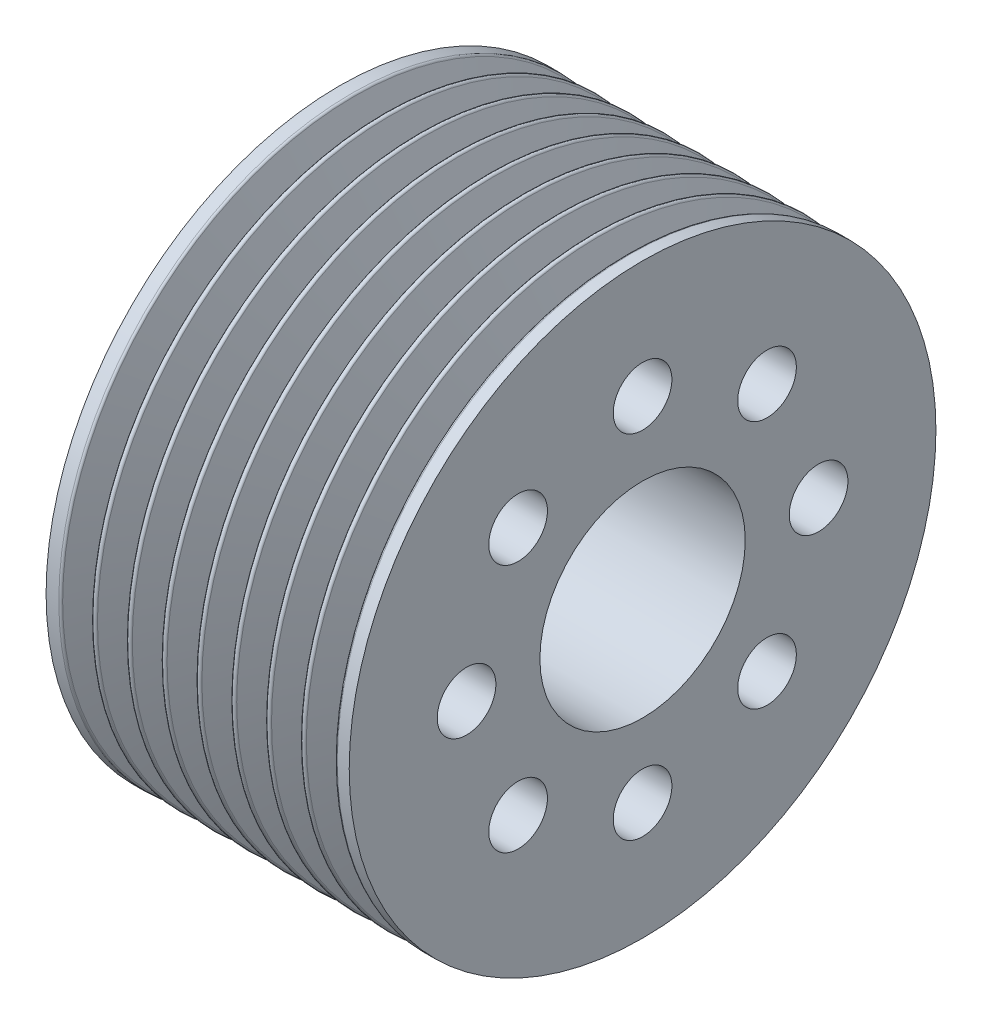
ISO-10303-21;
HEADER;
FILE_DESCRIPTION(('STEP AP214'),'2;1');
FILE_NAME('part.step','',(''),(''),'','','');
FILE_SCHEMA(('AUTOMOTIVE_DESIGN { 1 0 10303 214 1 1 1 1 }'));
ENDSEC;
DATA;
#1=APPLICATION_CONTEXT('core data for automotive mechanical design processes');
#2=APPLICATION_PROTOCOL_DEFINITION('international standard','automotive_design',2000,#1);
#3=PRODUCT_CONTEXT('',#1,'mechanical');
#4=PRODUCT('Part','Part','',(#3));
#5=PRODUCT_RELATED_PRODUCT_CATEGORY('part','',(#4));
#6=PRODUCT_DEFINITION_FORMATION('','',#4);
#7=PRODUCT_DEFINITION_CONTEXT('part definition',#1,'design');
#8=PRODUCT_DEFINITION('design','',#6,#7);
#9=PRODUCT_DEFINITION_SHAPE('','',#8);
#10=(LENGTH_UNIT() NAMED_UNIT(*) SI_UNIT(.MILLI.,.METRE.));
#11=(NAMED_UNIT(*) PLANE_ANGLE_UNIT() SI_UNIT($,.RADIAN.));
#12=(NAMED_UNIT(*) SI_UNIT($,.STERADIAN.) SOLID_ANGLE_UNIT());
#13=UNCERTAINTY_MEASURE_WITH_UNIT(LENGTH_MEASURE(1.E-05),#10,'distance_accuracy_value','');
#14=(GEOMETRIC_REPRESENTATION_CONTEXT(3) GLOBAL_UNCERTAINTY_ASSIGNED_CONTEXT((#13)) GLOBAL_UNIT_ASSIGNED_CONTEXT((#10,
#11,#12)) REPRESENTATION_CONTEXT('',''));
#15=CARTESIAN_POINT('',(0.,0.,0.));
#16=DIRECTION('',(0.,0.,1.));
#17=DIRECTION('',(1.,0.,0.));
#18=AXIS2_PLACEMENT_3D('',#15,#16,#17);
#19=CARTESIAN_POINT('',(0.,0.,0.));
#20=DIRECTION('',(-1.,0.,0.));
#21=DIRECTION('',(0.,0.,1.));
#22=AXIS2_PLACEMENT_3D('',#19,#20,#21);
#23=CYLINDRICAL_SURFACE('',#22,30.);
#24=CARTESIAN_POINT('',(18.,0.,0.));
#25=DIRECTION('',(-1.,0.,0.));
#26=DIRECTION('',(0.,0.,1.));
#27=AXIS2_PLACEMENT_3D('',#24,#25,#26);
#28=CIRCLE('',#27,30.);
#29=CARTESIAN_POINT('',(18.,0.,30.));
#30=VERTEX_POINT('',#29);
#31=EDGE_CURVE('E59',#30,#30,#28,.T.);
#32=ORIENTED_EDGE('',*,*,#31,.F.);
#33=EDGE_LOOP('',(#32));
#34=FACE_BOUND('',#33,.T.);
#35=CARTESIAN_POINT('',(19.3,0.,0.));
#36=DIRECTION('',(-1.,0.,0.));
#37=DIRECTION('',(0.,0.,1.));
#38=AXIS2_PLACEMENT_3D('',#35,#36,#37);
#39=CIRCLE('',#38,30.);
#40=CARTESIAN_POINT('',(19.3,0.,30.));
#41=VERTEX_POINT('',#40);
#42=EDGE_CURVE('E210',#41,#41,#39,.T.);
#43=ORIENTED_EDGE('',*,*,#42,.T.);
#44=EDGE_LOOP('',(#43));
#45=FACE_BOUND('',#44,.T.);
#46=ADVANCED_FACE('F45',(#34,#45),#23,.T.);
#47=CARTESIAN_POINT('',(31.5,10.5,0.));
#48=DIRECTION('',(1.,0.,0.));
#49=DIRECTION('',(0.,0.,-1.));
#50=AXIS2_PLACEMENT_3D('',#47,#48,#49);
#51=PLANE('',#50);
#52=CARTESIAN_POINT('',(31.5,12.7279220613579,12.7279220613579));
#53=DIRECTION('',(1.,0.,0.));
#54=DIRECTION('',(0.,0.,-1.));
#55=AXIS2_PLACEMENT_3D('',#52,#53,#54);
#56=CIRCLE('',#55,3.);
#57=CARTESIAN_POINT('',(31.5,12.7279220613579,9.72792206135786));
#58=VERTEX_POINT('',#57);
#59=EDGE_CURVE('E270',#58,#58,#56,.F.);
#60=ORIENTED_EDGE('',*,*,#59,.F.);
#61=EDGE_LOOP('',(#60));
#62=FACE_BOUND('',#61,.T.);
#63=CARTESIAN_POINT('',(31.5,-12.7279220613579,12.7279220613579));
#64=DIRECTION('',(1.,0.,0.));
#65=DIRECTION('',(0.,0.,-1.));
#66=AXIS2_PLACEMENT_3D('',#63,#64,#65);
#67=CIRCLE('',#66,3.);
#68=CARTESIAN_POINT('',(31.5,-12.7279220613579,9.72792206135786));
#69=VERTEX_POINT('',#68);
#70=EDGE_CURVE('E262',#69,#69,#67,.F.);
#71=ORIENTED_EDGE('',*,*,#70,.F.);
#72=EDGE_LOOP('',(#71));
#73=FACE_BOUND('',#72,.T.);
#74=CARTESIAN_POINT('',(31.5,-18.,0.));
#75=DIRECTION('',(1.,0.,0.));
#76=DIRECTION('',(0.,0.,-1.));
#77=AXIS2_PLACEMENT_3D('',#74,#75,#76);
#78=CIRCLE('',#77,3.);
#79=CARTESIAN_POINT('',(31.5,-18.,-3.));
#80=VERTEX_POINT('',#79);
#81=EDGE_CURVE('E254',#80,#80,#78,.F.);
#82=ORIENTED_EDGE('',*,*,#81,.F.);
#83=EDGE_LOOP('',(#82));
#84=FACE_BOUND('',#83,.T.);
#85=CARTESIAN_POINT('',(31.5,-12.7279220613579,-12.7279220613579));
#86=DIRECTION('',(1.,0.,0.));
#87=DIRECTION('',(0.,0.,-1.));
#88=AXIS2_PLACEMENT_3D('',#85,#86,#87);
#89=CIRCLE('',#88,3.);
#90=CARTESIAN_POINT('',(31.5,-12.7279220613579,-15.7279220613579));
#91=VERTEX_POINT('',#90);
#92=EDGE_CURVE('E246',#91,#91,#89,.F.);
#93=ORIENTED_EDGE('',*,*,#92,.F.);
#94=EDGE_LOOP('',(#93));
#95=FACE_BOUND('',#94,.T.);
#96=CARTESIAN_POINT('',(31.5,0.,-18.));
#97=DIRECTION('',(1.,0.,0.));
#98=DIRECTION('',(0.,0.,-1.));
#99=AXIS2_PLACEMENT_3D('',#96,#97,#98);
#100=CIRCLE('',#99,3.);
#101=CARTESIAN_POINT('',(31.5,0.,-21.));
#102=VERTEX_POINT('',#101);
#103=EDGE_CURVE('E238',#102,#102,#100,.F.);
#104=ORIENTED_EDGE('',*,*,#103,.F.);
#105=EDGE_LOOP('',(#104));
#106=FACE_BOUND('',#105,.T.);
#107=CARTESIAN_POINT('',(31.5,12.7279220613579,-12.7279220613579));
#108=DIRECTION('',(1.,0.,0.));
#109=DIRECTION('',(0.,0.,-1.));
#110=AXIS2_PLACEMENT_3D('',#107,#108,#109);
#111=CIRCLE('',#110,3.);
#112=CARTESIAN_POINT('',(31.5,12.7279220613579,-15.7279220613579));
#113=VERTEX_POINT('',#112);
#114=EDGE_CURVE('E230',#113,#113,#111,.F.);
#115=ORIENTED_EDGE('',*,*,#114,.F.);
#116=EDGE_LOOP('',(#115));
#117=FACE_BOUND('',#116,.T.);
#118=CARTESIAN_POINT('',(31.5,0.,18.));
#119=DIRECTION('',(1.,0.,0.));
#120=DIRECTION('',(0.,0.,-1.));
#121=AXIS2_PLACEMENT_3D('',#118,#119,#120);
#122=CIRCLE('',#121,3.);
#123=CARTESIAN_POINT('',(31.5,0.,15.));
#124=VERTEX_POINT('',#123);
#125=EDGE_CURVE('E222',#124,#124,#122,.F.);
#126=ORIENTED_EDGE('',*,*,#125,.F.);
#127=EDGE_LOOP('',(#126));
#128=FACE_BOUND('',#127,.T.);
#129=CARTESIAN_POINT('',(31.5,18.,0.));
#130=DIRECTION('',(1.,0.,0.));
#131=DIRECTION('',(0.,0.,-1.));
#132=AXIS2_PLACEMENT_3D('',#129,#130,#131);
#133=CIRCLE('',#132,3.);
#134=CARTESIAN_POINT('',(31.5,18.,-3.));
#135=VERTEX_POINT('',#134);
#136=EDGE_CURVE('E214',#135,#135,#133,.F.);
#137=ORIENTED_EDGE('',*,*,#136,.F.);
#138=EDGE_LOOP('',(#137));
#139=FACE_BOUND('',#138,.T.);
#140=CARTESIAN_POINT('',(31.5,0.,0.));
#141=DIRECTION('',(-1.,0.,0.));
#142=DIRECTION('',(0.,0.,1.));
#143=AXIS2_PLACEMENT_3D('',#140,#141,#142);
#144=CIRCLE('',#143,10.5);
#145=CARTESIAN_POINT('',(31.5,0.,10.5));
#146=VERTEX_POINT('',#145);
#147=EDGE_CURVE('E74',#146,#146,#144,.T.);
#148=ORIENTED_EDGE('',*,*,#147,.F.);
#149=EDGE_LOOP('',(#148));
#150=FACE_BOUND('',#149,.T.);
#151=CARTESIAN_POINT('',(31.5,0.,0.));
#152=DIRECTION('',(-1.,0.,0.));
#153=DIRECTION('',(0.,0.,1.));
#154=AXIS2_PLACEMENT_3D('',#151,#152,#153);
#155=CIRCLE('',#154,21.5);
#156=CARTESIAN_POINT('',(31.5,0.,21.5));
#157=VERTEX_POINT('',#156);
#158=EDGE_CURVE('E10',#157,#157,#155,.T.);
#159=ORIENTED_EDGE('',*,*,#158,.T.);
#160=EDGE_LOOP('',(#159));
#161=FACE_BOUND('',#160,.T.);
#162=ADVANCED_FACE('F48',(#62,#73,#84,#95,#106,#117,#128,#139,#150,#161),#51,.F.);
#163=CARTESIAN_POINT('',(0.,0.,0.));
#164=DIRECTION('',(-1.,0.,0.));
#165=DIRECTION('',(0.,0.,1.));
#166=AXIS2_PLACEMENT_3D('',#163,#164,#165);
#167=CYLINDRICAL_SURFACE('',#166,21.5);
#168=ORIENTED_EDGE('',*,*,#158,.F.);
#169=EDGE_LOOP('',(#168));
#170=FACE_BOUND('',#169,.T.);
#171=CARTESIAN_POINT('',(18.,0.,0.));
#172=DIRECTION('',(-1.,0.,0.));
#173=DIRECTION('',(0.,0.,1.));
#174=AXIS2_PLACEMENT_3D('',#171,#172,#173);
#175=CIRCLE('',#174,21.5);
#176=CARTESIAN_POINT('',(18.,0.,21.5));
#177=VERTEX_POINT('',#176);
#178=EDGE_CURVE('E54',#177,#177,#175,.T.);
#179=ORIENTED_EDGE('',*,*,#178,.T.);
#180=EDGE_LOOP('',(#179));
#181=FACE_BOUND('',#180,.T.);
#182=ADVANCED_FACE('F312',(#170,#181),#167,.F.);
#183=CARTESIAN_POINT('',(18.,30.,0.));
#184=DIRECTION('',(1.,0.,0.));
#185=DIRECTION('',(0.,0.,-1.));
#186=AXIS2_PLACEMENT_3D('',#183,#184,#185);
#187=PLANE('',#186);
#188=ORIENTED_EDGE('',*,*,#178,.F.);
#189=EDGE_LOOP('',(#188));
#190=FACE_BOUND('',#189,.T.);
#191=ORIENTED_EDGE('',*,*,#31,.T.);
#192=EDGE_LOOP('',(#191));
#193=FACE_BOUND('',#192,.T.);
#194=ADVANCED_FACE('F318',(#190,#193),#187,.F.);
#195=CARTESIAN_POINT('',(47.78,0.,0.));
#196=DIRECTION('',(-1.,0.,0.));
#197=DIRECTION('',(0.,0.,1.));
#198=AXIS2_PLACEMENT_3D('',#195,#196,#197);
#199=CIRCLE('',#198,30.);
#200=CARTESIAN_POINT('',(47.78,0.,30.));
#201=VERTEX_POINT('',#200);
#202=EDGE_CURVE('E94',#201,#201,#199,.T.);
#203=ORIENTED_EDGE('',*,*,#202,.F.);
#204=EDGE_LOOP('',(#203));
#205=FACE_BOUND('',#204,.T.);
#206=CARTESIAN_POINT('',(49.,0.,0.));
#207=DIRECTION('',(-1.,0.,0.));
#208=DIRECTION('',(0.,0.,1.));
#209=AXIS2_PLACEMENT_3D('',#206,#207,#208);
#210=CIRCLE('',#209,30.);
#211=CARTESIAN_POINT('',(49.,0.,30.));
#212=VERTEX_POINT('',#211);
#213=EDGE_CURVE('E64',#212,#212,#210,.T.);
#214=ORIENTED_EDGE('',*,*,#213,.T.);
#215=EDGE_LOOP('',(#214));
#216=FACE_BOUND('',#215,.T.);
#217=ADVANCED_FACE('F285',(#205,#216),#23,.T.);
#218=CARTESIAN_POINT('',(49.,10.5,0.));
#219=DIRECTION('',(-1.,0.,0.));
#220=DIRECTION('',(0.,0.,1.));
#221=AXIS2_PLACEMENT_3D('',#218,#219,#220);
#222=PLANE('',#221);
#223=CARTESIAN_POINT('',(49.,12.7279220613579,12.7279220613579));
#224=DIRECTION('',(1.,0.,0.));
#225=DIRECTION('',(0.,0.,-1.));
#226=AXIS2_PLACEMENT_3D('',#223,#224,#225);
#227=CIRCLE('',#226,3.);
#228=CARTESIAN_POINT('',(49.,12.7279220613579,9.72792206135786));
#229=VERTEX_POINT('',#228);
#230=EDGE_CURVE('E274',#229,#229,#227,.T.);
#231=ORIENTED_EDGE('',*,*,#230,.F.);
#232=EDGE_LOOP('',(#231));
#233=FACE_BOUND('',#232,.T.);
#234=CARTESIAN_POINT('',(49.,-12.7279220613579,12.7279220613579));
#235=DIRECTION('',(1.,0.,0.));
#236=DIRECTION('',(0.,0.,-1.));
#237=AXIS2_PLACEMENT_3D('',#234,#235,#236);
#238=CIRCLE('',#237,3.);
#239=CARTESIAN_POINT('',(49.,-12.7279220613579,9.72792206135786));
#240=VERTEX_POINT('',#239);
#241=EDGE_CURVE('E266',#240,#240,#238,.T.);
#242=ORIENTED_EDGE('',*,*,#241,.F.);
#243=EDGE_LOOP('',(#242));
#244=FACE_BOUND('',#243,.T.);
#245=CARTESIAN_POINT('',(49.,-18.,0.));
#246=DIRECTION('',(1.,0.,0.));
#247=DIRECTION('',(0.,0.,-1.));
#248=AXIS2_PLACEMENT_3D('',#245,#246,#247);
#249=CIRCLE('',#248,3.);
#250=CARTESIAN_POINT('',(49.,-18.,-3.));
#251=VERTEX_POINT('',#250);
#252=EDGE_CURVE('E258',#251,#251,#249,.T.);
#253=ORIENTED_EDGE('',*,*,#252,.F.);
#254=EDGE_LOOP('',(#253));
#255=FACE_BOUND('',#254,.T.);
#256=CARTESIAN_POINT('',(49.,-12.7279220613579,-12.7279220613579));
#257=DIRECTION('',(1.,0.,0.));
#258=DIRECTION('',(0.,0.,-1.));
#259=AXIS2_PLACEMENT_3D('',#256,#257,#258);
#260=CIRCLE('',#259,3.);
#261=CARTESIAN_POINT('',(49.,-12.7279220613579,-15.7279220613579));
#262=VERTEX_POINT('',#261);
#263=EDGE_CURVE('E250',#262,#262,#260,.T.);
#264=ORIENTED_EDGE('',*,*,#263,.F.);
#265=EDGE_LOOP('',(#264));
#266=FACE_BOUND('',#265,.T.);
#267=CARTESIAN_POINT('',(49.,0.,-18.));
#268=DIRECTION('',(1.,0.,0.));
#269=DIRECTION('',(0.,0.,-1.));
#270=AXIS2_PLACEMENT_3D('',#267,#268,#269);
#271=CIRCLE('',#270,3.);
#272=CARTESIAN_POINT('',(49.,0.,-21.));
#273=VERTEX_POINT('',#272);
#274=EDGE_CURVE('E242',#273,#273,#271,.T.);
#275=ORIENTED_EDGE('',*,*,#274,.F.);
#276=EDGE_LOOP('',(#275));
#277=FACE_BOUND('',#276,.T.);
#278=CARTESIAN_POINT('',(49.,12.7279220613579,-12.7279220613579));
#279=DIRECTION('',(1.,0.,0.));
#280=DIRECTION('',(0.,0.,-1.));
#281=AXIS2_PLACEMENT_3D('',#278,#279,#280);
#282=CIRCLE('',#281,3.);
#283=CARTESIAN_POINT('',(49.,12.7279220613579,-15.7279220613579));
#284=VERTEX_POINT('',#283);
#285=EDGE_CURVE('E234',#284,#284,#282,.T.);
#286=ORIENTED_EDGE('',*,*,#285,.F.);
#287=EDGE_LOOP('',(#286));
#288=FACE_BOUND('',#287,.T.);
#289=CARTESIAN_POINT('',(49.,0.,18.));
#290=DIRECTION('',(1.,0.,0.));
#291=DIRECTION('',(0.,0.,-1.));
#292=AXIS2_PLACEMENT_3D('',#289,#290,#291);
#293=CIRCLE('',#292,3.);
#294=CARTESIAN_POINT('',(49.,0.,15.));
#295=VERTEX_POINT('',#294);
#296=EDGE_CURVE('E226',#295,#295,#293,.T.);
#297=ORIENTED_EDGE('',*,*,#296,.F.);
#298=EDGE_LOOP('',(#297));
#299=FACE_BOUND('',#298,.T.);
#300=CARTESIAN_POINT('',(49.,18.,0.));
#301=DIRECTION('',(1.,0.,0.));
#302=DIRECTION('',(0.,0.,-1.));
#303=AXIS2_PLACEMENT_3D('',#300,#301,#302);
#304=CIRCLE('',#303,3.);
#305=CARTESIAN_POINT('',(49.,18.,-3.));
#306=VERTEX_POINT('',#305);
#307=EDGE_CURVE('E218',#306,#306,#304,.T.);
#308=ORIENTED_EDGE('',*,*,#307,.F.);
#309=EDGE_LOOP('',(#308));
#310=FACE_BOUND('',#309,.T.);
#311=ORIENTED_EDGE('',*,*,#213,.F.);
#312=EDGE_LOOP('',(#311));
#313=FACE_BOUND('',#312,.T.);
#314=CARTESIAN_POINT('',(49.,0.,0.));
#315=DIRECTION('',(-1.,0.,0.));
#316=DIRECTION('',(0.,0.,1.));
#317=AXIS2_PLACEMENT_3D('',#314,#315,#316);
#318=CIRCLE('',#317,10.5);
#319=CARTESIAN_POINT('',(49.,0.,10.5));
#320=VERTEX_POINT('',#319);
#321=EDGE_CURVE('E70',#320,#320,#318,.T.);
#322=ORIENTED_EDGE('',*,*,#321,.T.);
#323=EDGE_LOOP('',(#322));
#324=FACE_BOUND('',#323,.T.);
#325=ADVANCED_FACE('F281',(#233,#244,#255,#266,#277,#288,#299,#310,#313,#324),#222,.F.);
#326=CARTESIAN_POINT('',(0.,0.,0.));
#327=DIRECTION('',(-1.,0.,0.));
#328=DIRECTION('',(0.,0.,1.));
#329=AXIS2_PLACEMENT_3D('',#326,#327,#328);
#330=CYLINDRICAL_SURFACE('',#329,10.5);
#331=ORIENTED_EDGE('',*,*,#321,.F.);
#332=EDGE_LOOP('',(#331));
#333=FACE_BOUND('',#332,.T.);
#334=ORIENTED_EDGE('',*,*,#147,.T.);
#335=EDGE_LOOP('',(#334));
#336=FACE_BOUND('',#335,.T.);
#337=ADVANCED_FACE('F284',(#333,#336),#330,.F.);
#338=CARTESIAN_POINT('',(47.78,0.,0.));
#339=DIRECTION('',(-1.,0.,0.));
#340=DIRECTION('',(0.,0.,1.));
#341=AXIS2_PLACEMENT_3D('',#338,#339,#340);
#342=TOROIDAL_SURFACE('',#341,29.75,0.249999999999997);
#343=ORIENTED_EDGE('',*,*,#202,.T.);
#344=EDGE_LOOP('',(#343));
#345=FACE_BOUND('',#344,.T.);
#346=CARTESIAN_POINT('',(47.5458319526879,0.,0.));
#347=DIRECTION('',(-1.,0.,0.));
#348=DIRECTION('',(0.,0.,1.));
#349=AXIS2_PLACEMENT_3D('',#346,#347,#348);
#350=CIRCLE('',#349,29.8375518453149);
#351=CARTESIAN_POINT('',(47.5458319526879,0.,29.8375518453149));
#352=VERTEX_POINT('',#351);
#353=EDGE_CURVE('E78',#352,#352,#350,.T.);
#354=ORIENTED_EDGE('',*,*,#353,.F.);
#355=EDGE_LOOP('',(#354));
#356=FACE_BOUND('',#355,.T.);
#357=ADVANCED_FACE('F307',(#345,#356),#342,.T.);
#358=CARTESIAN_POINT('',(46.2810016567745,0.,0.));
#359=DIRECTION('',(1.,0.,0.));
#360=DIRECTION('',(0.,0.,-1.));
#361=AXIS2_PLACEMENT_3D('',#358,#359,#360);
#362=CONICAL_SURFACE('',#361,26.4546095496951,1.21300383013606);
#363=ORIENTED_EDGE('',*,*,#353,.T.);
#364=EDGE_LOOP('',(#363));
#365=FACE_BOUND('',#364,.T.);
#366=CARTESIAN_POINT('',(46.2810016567745,0.,0.));
#367=DIRECTION('',(-1.,0.,0.));
#368=DIRECTION('',(0.,0.,1.));
#369=AXIS2_PLACEMENT_3D('',#366,#367,#368);
#370=CIRCLE('',#369,26.4546095496951);
#371=CARTESIAN_POINT('',(46.2810016567745,0.,26.4546095496951));
#372=VERTEX_POINT('',#371);
#373=EDGE_CURVE('E82',#372,#372,#370,.T.);
#374=ORIENTED_EDGE('',*,*,#373,.F.);
#375=EDGE_LOOP('',(#374));
#376=FACE_BOUND('',#375,.T.);
#377=ADVANCED_FACE('F508',(#365,#376),#362,.T.);
#378=CARTESIAN_POINT('',(46.,0.,0.));
#379=DIRECTION('',(-1.,0.,0.));
#380=DIRECTION('',(0.,0.,1.));
#381=AXIS2_PLACEMENT_3D('',#378,#379,#380);
#382=TOROIDAL_SURFACE('',#381,26.5596717640729,0.300000000000001);
#383=ORIENTED_EDGE('',*,*,#373,.T.);
#384=EDGE_LOOP('',(#383));
#385=FACE_BOUND('',#384,.T.);
#386=CARTESIAN_POINT('',(45.7189983432255,0.,0.));
#387=DIRECTION('',(-1.,0.,0.));
#388=DIRECTION('',(0.,0.,1.));
#389=AXIS2_PLACEMENT_3D('',#386,#387,#388);
#390=CIRCLE('',#389,26.4546095496951);
#391=CARTESIAN_POINT('',(45.7189983432255,0.,26.4546095496951));
#392=VERTEX_POINT('',#391);
#393=EDGE_CURVE('E86',#392,#392,#390,.T.);
#394=ORIENTED_EDGE('',*,*,#393,.F.);
#395=EDGE_LOOP('',(#394));
#396=FACE_BOUND('',#395,.T.);
#397=ADVANCED_FACE('F503',(#385,#396),#382,.F.);
#398=CARTESIAN_POINT('',(44.4541680473121,0.,0.));
#399=DIRECTION('',(-1.,0.,0.));
#400=DIRECTION('',(0.,0.,1.));
#401=AXIS2_PLACEMENT_3D('',#398,#399,#400);
#402=CONICAL_SURFACE('',#401,29.8375518453149,1.21300383013606);
#403=ORIENTED_EDGE('',*,*,#393,.T.);
#404=EDGE_LOOP('',(#403));
#405=FACE_BOUND('',#404,.T.);
#406=CARTESIAN_POINT('',(44.4541680473121,0.,0.));
#407=DIRECTION('',(-1.,0.,0.));
#408=DIRECTION('',(0.,0.,1.));
#409=AXIS2_PLACEMENT_3D('',#406,#407,#408);
#410=CIRCLE('',#409,29.8375518453149);
#411=CARTESIAN_POINT('',(44.4541680473121,0.,29.8375518453149));
#412=VERTEX_POINT('',#411);
#413=EDGE_CURVE('E90',#412,#412,#410,.T.);
#414=ORIENTED_EDGE('',*,*,#413,.F.);
#415=EDGE_LOOP('',(#414));
#416=FACE_BOUND('',#415,.T.);
#417=ADVANCED_FACE('F498',(#405,#416),#402,.T.);
#418=CARTESIAN_POINT('',(44.22,0.,0.));
#419=DIRECTION('',(-1.,0.,0.));
#420=DIRECTION('',(0.,0.,1.));
#421=AXIS2_PLACEMENT_3D('',#418,#419,#420);
#422=TOROIDAL_SURFACE('',#421,29.75,0.250000000000004);
#423=ORIENTED_EDGE('',*,*,#413,.T.);
#424=EDGE_LOOP('',(#423));
#425=FACE_BOUND('',#424,.T.);
#426=CARTESIAN_POINT('',(43.9858319526879,0.,0.));
#427=DIRECTION('',(-1.,0.,0.));
#428=DIRECTION('',(0.,0.,1.));
#429=AXIS2_PLACEMENT_3D('',#426,#427,#428);
#430=CIRCLE('',#429,29.8375518453149);
#431=CARTESIAN_POINT('',(43.9858319526879,0.,29.8375518453149));
#432=VERTEX_POINT('',#431);
#433=EDGE_CURVE('E98',#432,#432,#430,.T.);
#434=ORIENTED_EDGE('',*,*,#433,.F.);
#435=EDGE_LOOP('',(#434));
#436=FACE_BOUND('',#435,.T.);
#437=ADVANCED_FACE('F493',(#425,#436),#422,.T.);
#438=CARTESIAN_POINT('',(42.7210016567745,0.,0.));
#439=DIRECTION('',(1.,0.,0.));
#440=DIRECTION('',(0.,0.,-1.));
#441=AXIS2_PLACEMENT_3D('',#438,#439,#440);
#442=CONICAL_SURFACE('',#441,26.4546095496951,1.21300383013606);
#443=ORIENTED_EDGE('',*,*,#433,.T.);
#444=EDGE_LOOP('',(#443));
#445=FACE_BOUND('',#444,.T.);
#446=CARTESIAN_POINT('',(42.7210016567745,0.,0.));
#447=DIRECTION('',(-1.,0.,0.));
#448=DIRECTION('',(0.,0.,1.));
#449=AXIS2_PLACEMENT_3D('',#446,#447,#448);
#450=CIRCLE('',#449,26.4546095496951);
#451=CARTESIAN_POINT('',(42.7210016567745,0.,26.4546095496951));
#452=VERTEX_POINT('',#451);
#453=EDGE_CURVE('E102',#452,#452,#450,.T.);
#454=ORIENTED_EDGE('',*,*,#453,.F.);
#455=EDGE_LOOP('',(#454));
#456=FACE_BOUND('',#455,.T.);
#457=ADVANCED_FACE('F488',(#445,#456),#442,.T.);
#458=CARTESIAN_POINT('',(42.44,0.,0.));
#459=DIRECTION('',(-1.,0.,0.));
#460=DIRECTION('',(0.,0.,1.));
#461=AXIS2_PLACEMENT_3D('',#458,#459,#460);
#462=TOROIDAL_SURFACE('',#461,26.5596717640729,0.300000000000001);
#463=ORIENTED_EDGE('',*,*,#453,.T.);
#464=EDGE_LOOP('',(#463));
#465=FACE_BOUND('',#464,.T.);
#466=CARTESIAN_POINT('',(42.1589983432255,0.,0.));
#467=DIRECTION('',(-1.,0.,0.));
#468=DIRECTION('',(0.,0.,1.));
#469=AXIS2_PLACEMENT_3D('',#466,#467,#468);
#470=CIRCLE('',#469,26.4546095496951);
#471=CARTESIAN_POINT('',(42.1589983432255,0.,26.4546095496951));
#472=VERTEX_POINT('',#471);
#473=EDGE_CURVE('E106',#472,#472,#470,.T.);
#474=ORIENTED_EDGE('',*,*,#473,.F.);
#475=EDGE_LOOP('',(#474));
#476=FACE_BOUND('',#475,.T.);
#477=ADVANCED_FACE('F483',(#465,#476),#462,.F.);
#478=CARTESIAN_POINT('',(40.8941680473121,0.,0.));
#479=DIRECTION('',(-1.,0.,0.));
#480=DIRECTION('',(0.,0.,1.));
#481=AXIS2_PLACEMENT_3D('',#478,#479,#480);
#482=CONICAL_SURFACE('',#481,29.8375518453149,1.21300383013606);
#483=ORIENTED_EDGE('',*,*,#473,.T.);
#484=EDGE_LOOP('',(#483));
#485=FACE_BOUND('',#484,.T.);
#486=CARTESIAN_POINT('',(40.8941680473121,0.,0.));
#487=DIRECTION('',(-1.,0.,0.));
#488=DIRECTION('',(0.,0.,1.));
#489=AXIS2_PLACEMENT_3D('',#486,#487,#488);
#490=CIRCLE('',#489,29.8375518453149);
#491=CARTESIAN_POINT('',(40.8941680473121,0.,29.8375518453149));
#492=VERTEX_POINT('',#491);
#493=EDGE_CURVE('E110',#492,#492,#490,.T.);
#494=ORIENTED_EDGE('',*,*,#493,.F.);
#495=EDGE_LOOP('',(#494));
#496=FACE_BOUND('',#495,.T.);
#497=ADVANCED_FACE('F478',(#485,#496),#482,.T.);
#498=CARTESIAN_POINT('',(40.66,0.,0.));
#499=DIRECTION('',(-1.,0.,0.));
#500=DIRECTION('',(0.,0.,1.));
#501=AXIS2_PLACEMENT_3D('',#498,#499,#500);
#502=TOROIDAL_SURFACE('',#501,29.75,0.250000000000004);
#503=ORIENTED_EDGE('',*,*,#493,.T.);
#504=EDGE_LOOP('',(#503));
#505=FACE_BOUND('',#504,.T.);
#506=CARTESIAN_POINT('',(40.4258319526879,0.,0.));
#507=DIRECTION('',(-1.,0.,0.));
#508=DIRECTION('',(0.,0.,1.));
#509=AXIS2_PLACEMENT_3D('',#506,#507,#508);
#510=CIRCLE('',#509,29.8375518453149);
#511=CARTESIAN_POINT('',(40.4258319526879,0.,29.8375518453149));
#512=VERTEX_POINT('',#511);
#513=EDGE_CURVE('E114',#512,#512,#510,.T.);
#514=ORIENTED_EDGE('',*,*,#513,.F.);
#515=EDGE_LOOP('',(#514));
#516=FACE_BOUND('',#515,.T.);
#517=ADVANCED_FACE('F473',(#505,#516),#502,.T.);
#518=CARTESIAN_POINT('',(39.1610016567745,0.,0.));
#519=DIRECTION('',(1.,0.,0.));
#520=DIRECTION('',(0.,0.,-1.));
#521=AXIS2_PLACEMENT_3D('',#518,#519,#520);
#522=CONICAL_SURFACE('',#521,26.4546095496951,1.21300383013606);
#523=ORIENTED_EDGE('',*,*,#513,.T.);
#524=EDGE_LOOP('',(#523));
#525=FACE_BOUND('',#524,.T.);
#526=CARTESIAN_POINT('',(39.1610016567745,0.,0.));
#527=DIRECTION('',(-1.,0.,0.));
#528=DIRECTION('',(0.,0.,1.));
#529=AXIS2_PLACEMENT_3D('',#526,#527,#528);
#530=CIRCLE('',#529,26.4546095496951);
#531=CARTESIAN_POINT('',(39.1610016567745,0.,26.4546095496951));
#532=VERTEX_POINT('',#531);
#533=EDGE_CURVE('E118',#532,#532,#530,.T.);
#534=ORIENTED_EDGE('',*,*,#533,.F.);
#535=EDGE_LOOP('',(#534));
#536=FACE_BOUND('',#535,.T.);
#537=ADVANCED_FACE('F468',(#525,#536),#522,.T.);
#538=CARTESIAN_POINT('',(38.88,0.,0.));
#539=DIRECTION('',(-1.,0.,0.));
#540=DIRECTION('',(0.,0.,1.));
#541=AXIS2_PLACEMENT_3D('',#538,#539,#540);
#542=TOROIDAL_SURFACE('',#541,26.5596717640729,0.300000000000001);
#543=ORIENTED_EDGE('',*,*,#533,.T.);
#544=EDGE_LOOP('',(#543));
#545=FACE_BOUND('',#544,.T.);
#546=CARTESIAN_POINT('',(38.5989983432255,0.,0.));
#547=DIRECTION('',(-1.,0.,0.));
#548=DIRECTION('',(0.,0.,1.));
#549=AXIS2_PLACEMENT_3D('',#546,#547,#548);
#550=CIRCLE('',#549,26.4546095496951);
#551=CARTESIAN_POINT('',(38.5989983432255,0.,26.4546095496951));
#552=VERTEX_POINT('',#551);
#553=EDGE_CURVE('E122',#552,#552,#550,.T.);
#554=ORIENTED_EDGE('',*,*,#553,.F.);
#555=EDGE_LOOP('',(#554));
#556=FACE_BOUND('',#555,.T.);
#557=ADVANCED_FACE('F463',(#545,#556),#542,.F.);
#558=CARTESIAN_POINT('',(37.3341680473121,0.,0.));
#559=DIRECTION('',(-1.,0.,0.));
#560=DIRECTION('',(0.,0.,1.));
#561=AXIS2_PLACEMENT_3D('',#558,#559,#560);
#562=CONICAL_SURFACE('',#561,29.8375518453149,1.21300383013606);
#563=ORIENTED_EDGE('',*,*,#553,.T.);
#564=EDGE_LOOP('',(#563));
#565=FACE_BOUND('',#564,.T.);
#566=CARTESIAN_POINT('',(37.3341680473121,0.,0.));
#567=DIRECTION('',(-1.,0.,0.));
#568=DIRECTION('',(0.,0.,1.));
#569=AXIS2_PLACEMENT_3D('',#566,#567,#568);
#570=CIRCLE('',#569,29.8375518453149);
#571=CARTESIAN_POINT('',(37.3341680473121,0.,29.8375518453149));
#572=VERTEX_POINT('',#571);
#573=EDGE_CURVE('E126',#572,#572,#570,.T.);
#574=ORIENTED_EDGE('',*,*,#573,.F.);
#575=EDGE_LOOP('',(#574));
#576=FACE_BOUND('',#575,.T.);
#577=ADVANCED_FACE('F458',(#565,#576),#562,.T.);
#578=CARTESIAN_POINT('',(37.1,0.,0.));
#579=DIRECTION('',(-1.,0.,0.));
#580=DIRECTION('',(0.,0.,1.));
#581=AXIS2_PLACEMENT_3D('',#578,#579,#580);
#582=TOROIDAL_SURFACE('',#581,29.75,0.250000000000004);
#583=ORIENTED_EDGE('',*,*,#573,.T.);
#584=EDGE_LOOP('',(#583));
#585=FACE_BOUND('',#584,.T.);
#586=CARTESIAN_POINT('',(36.8658319526879,0.,0.));
#587=DIRECTION('',(-1.,0.,0.));
#588=DIRECTION('',(0.,0.,1.));
#589=AXIS2_PLACEMENT_3D('',#586,#587,#588);
#590=CIRCLE('',#589,29.8375518453149);
#591=CARTESIAN_POINT('',(36.8658319526879,0.,29.8375518453149));
#592=VERTEX_POINT('',#591);
#593=EDGE_CURVE('E130',#592,#592,#590,.T.);
#594=ORIENTED_EDGE('',*,*,#593,.F.);
#595=EDGE_LOOP('',(#594));
#596=FACE_BOUND('',#595,.T.);
#597=ADVANCED_FACE('F453',(#585,#596),#582,.T.);
#598=CARTESIAN_POINT('',(35.6010016567745,0.,0.));
#599=DIRECTION('',(1.,0.,0.));
#600=DIRECTION('',(0.,0.,-1.));
#601=AXIS2_PLACEMENT_3D('',#598,#599,#600);
#602=CONICAL_SURFACE('',#601,26.4546095496951,1.21300383013606);
#603=ORIENTED_EDGE('',*,*,#593,.T.);
#604=EDGE_LOOP('',(#603));
#605=FACE_BOUND('',#604,.T.);
#606=CARTESIAN_POINT('',(35.6010016567745,0.,0.));
#607=DIRECTION('',(-1.,0.,0.));
#608=DIRECTION('',(0.,0.,1.));
#609=AXIS2_PLACEMENT_3D('',#606,#607,#608);
#610=CIRCLE('',#609,26.4546095496951);
#611=CARTESIAN_POINT('',(35.6010016567745,0.,26.4546095496951));
#612=VERTEX_POINT('',#611);
#613=EDGE_CURVE('E134',#612,#612,#610,.T.);
#614=ORIENTED_EDGE('',*,*,#613,.F.);
#615=EDGE_LOOP('',(#614));
#616=FACE_BOUND('',#615,.T.);
#617=ADVANCED_FACE('F448',(#605,#616),#602,.T.);
#618=CARTESIAN_POINT('',(35.32,0.,0.));
#619=DIRECTION('',(-1.,0.,0.));
#620=DIRECTION('',(0.,0.,1.));
#621=AXIS2_PLACEMENT_3D('',#618,#619,#620);
#622=TOROIDAL_SURFACE('',#621,26.5596717640729,0.300000000000001);
#623=ORIENTED_EDGE('',*,*,#613,.T.);
#624=EDGE_LOOP('',(#623));
#625=FACE_BOUND('',#624,.T.);
#626=CARTESIAN_POINT('',(35.0389983432255,0.,0.));
#627=DIRECTION('',(-1.,0.,0.));
#628=DIRECTION('',(0.,0.,1.));
#629=AXIS2_PLACEMENT_3D('',#626,#627,#628);
#630=CIRCLE('',#629,26.4546095496951);
#631=CARTESIAN_POINT('',(35.0389983432255,0.,26.4546095496951));
#632=VERTEX_POINT('',#631);
#633=EDGE_CURVE('E138',#632,#632,#630,.T.);
#634=ORIENTED_EDGE('',*,*,#633,.F.);
#635=EDGE_LOOP('',(#634));
#636=FACE_BOUND('',#635,.T.);
#637=ADVANCED_FACE('F443',(#625,#636),#622,.F.);
#638=CARTESIAN_POINT('',(33.7741680473121,0.,0.));
#639=DIRECTION('',(-1.,0.,0.));
#640=DIRECTION('',(0.,0.,1.));
#641=AXIS2_PLACEMENT_3D('',#638,#639,#640);
#642=CONICAL_SURFACE('',#641,29.8375518453149,1.21300383013606);
#643=ORIENTED_EDGE('',*,*,#633,.T.);
#644=EDGE_LOOP('',(#643));
#645=FACE_BOUND('',#644,.T.);
#646=CARTESIAN_POINT('',(33.7741680473121,0.,0.));
#647=DIRECTION('',(-1.,0.,0.));
#648=DIRECTION('',(0.,0.,1.));
#649=AXIS2_PLACEMENT_3D('',#646,#647,#648);
#650=CIRCLE('',#649,29.8375518453149);
#651=CARTESIAN_POINT('',(33.7741680473121,0.,29.8375518453149));
#652=VERTEX_POINT('',#651);
#653=EDGE_CURVE('E142',#652,#652,#650,.T.);
#654=ORIENTED_EDGE('',*,*,#653,.F.);
#655=EDGE_LOOP('',(#654));
#656=FACE_BOUND('',#655,.T.);
#657=ADVANCED_FACE('F438',(#645,#656),#642,.T.);
#658=CARTESIAN_POINT('',(33.54,0.,0.));
#659=DIRECTION('',(-1.,0.,0.));
#660=DIRECTION('',(0.,0.,1.));
#661=AXIS2_PLACEMENT_3D('',#658,#659,#660);
#662=TOROIDAL_SURFACE('',#661,29.75,0.250000000000004);
#663=ORIENTED_EDGE('',*,*,#653,.T.);
#664=EDGE_LOOP('',(#663));
#665=FACE_BOUND('',#664,.T.);
#666=CARTESIAN_POINT('',(33.3058319526879,0.,0.));
#667=DIRECTION('',(-1.,0.,0.));
#668=DIRECTION('',(0.,0.,1.));
#669=AXIS2_PLACEMENT_3D('',#666,#667,#668);
#670=CIRCLE('',#669,29.8375518453149);
#671=CARTESIAN_POINT('',(33.3058319526879,0.,29.8375518453149));
#672=VERTEX_POINT('',#671);
#673=EDGE_CURVE('E146',#672,#672,#670,.T.);
#674=ORIENTED_EDGE('',*,*,#673,.F.);
#675=EDGE_LOOP('',(#674));
#676=FACE_BOUND('',#675,.T.);
#677=ADVANCED_FACE('F433',(#665,#676),#662,.T.);
#678=CARTESIAN_POINT('',(32.0410016567745,0.,0.));
#679=DIRECTION('',(1.,0.,0.));
#680=DIRECTION('',(0.,0.,-1.));
#681=AXIS2_PLACEMENT_3D('',#678,#679,#680);
#682=CONICAL_SURFACE('',#681,26.4546095496951,1.21300383013606);
#683=ORIENTED_EDGE('',*,*,#673,.T.);
#684=EDGE_LOOP('',(#683));
#685=FACE_BOUND('',#684,.T.);
#686=CARTESIAN_POINT('',(32.0410016567745,0.,0.));
#687=DIRECTION('',(-1.,0.,0.));
#688=DIRECTION('',(0.,0.,1.));
#689=AXIS2_PLACEMENT_3D('',#686,#687,#688);
#690=CIRCLE('',#689,26.4546095496951);
#691=CARTESIAN_POINT('',(32.0410016567745,0.,26.4546095496951));
#692=VERTEX_POINT('',#691);
#693=EDGE_CURVE('E150',#692,#692,#690,.T.);
#694=ORIENTED_EDGE('',*,*,#693,.F.);
#695=EDGE_LOOP('',(#694));
#696=FACE_BOUND('',#695,.T.);
#697=ADVANCED_FACE('F428',(#685,#696),#682,.T.);
#698=CARTESIAN_POINT('',(31.76,0.,0.));
#699=DIRECTION('',(-1.,0.,0.));
#700=DIRECTION('',(0.,0.,1.));
#701=AXIS2_PLACEMENT_3D('',#698,#699,#700);
#702=TOROIDAL_SURFACE('',#701,26.5596717640729,0.300000000000001);
#703=ORIENTED_EDGE('',*,*,#693,.T.);
#704=EDGE_LOOP('',(#703));
#705=FACE_BOUND('',#704,.T.);
#706=CARTESIAN_POINT('',(31.4789983432255,0.,0.));
#707=DIRECTION('',(-1.,0.,0.));
#708=DIRECTION('',(0.,0.,1.));
#709=AXIS2_PLACEMENT_3D('',#706,#707,#708);
#710=CIRCLE('',#709,26.4546095496951);
#711=CARTESIAN_POINT('',(31.4789983432255,0.,26.4546095496951));
#712=VERTEX_POINT('',#711);
#713=EDGE_CURVE('E154',#712,#712,#710,.T.);
#714=ORIENTED_EDGE('',*,*,#713,.F.);
#715=EDGE_LOOP('',(#714));
#716=FACE_BOUND('',#715,.T.);
#717=ADVANCED_FACE('F423',(#705,#716),#702,.F.);
#718=CARTESIAN_POINT('',(30.2141680473121,0.,0.));
#719=DIRECTION('',(-1.,0.,0.));
#720=DIRECTION('',(0.,0.,1.));
#721=AXIS2_PLACEMENT_3D('',#718,#719,#720);
#722=CONICAL_SURFACE('',#721,29.8375518453149,1.21300383013606);
#723=ORIENTED_EDGE('',*,*,#713,.T.);
#724=EDGE_LOOP('',(#723));
#725=FACE_BOUND('',#724,.T.);
#726=CARTESIAN_POINT('',(30.2141680473121,0.,0.));
#727=DIRECTION('',(-1.,0.,0.));
#728=DIRECTION('',(0.,0.,1.));
#729=AXIS2_PLACEMENT_3D('',#726,#727,#728);
#730=CIRCLE('',#729,29.8375518453149);
#731=CARTESIAN_POINT('',(30.2141680473121,0.,29.8375518453149));
#732=VERTEX_POINT('',#731);
#733=EDGE_CURVE('E158',#732,#732,#730,.T.);
#734=ORIENTED_EDGE('',*,*,#733,.F.);
#735=EDGE_LOOP('',(#734));
#736=FACE_BOUND('',#735,.T.);
#737=ADVANCED_FACE('F418',(#725,#736),#722,.T.);
#738=CARTESIAN_POINT('',(29.98,0.,0.));
#739=DIRECTION('',(-1.,0.,0.));
#740=DIRECTION('',(0.,0.,1.));
#741=AXIS2_PLACEMENT_3D('',#738,#739,#740);
#742=TOROIDAL_SURFACE('',#741,29.75,0.250000000000004);
#743=ORIENTED_EDGE('',*,*,#733,.T.);
#744=EDGE_LOOP('',(#743));
#745=FACE_BOUND('',#744,.T.);
#746=CARTESIAN_POINT('',(29.7458319526879,0.,0.));
#747=DIRECTION('',(-1.,0.,0.));
#748=DIRECTION('',(0.,0.,1.));
#749=AXIS2_PLACEMENT_3D('',#746,#747,#748);
#750=CIRCLE('',#749,29.8375518453149);
#751=CARTESIAN_POINT('',(29.7458319526879,0.,29.8375518453149));
#752=VERTEX_POINT('',#751);
#753=EDGE_CURVE('E162',#752,#752,#750,.T.);
#754=ORIENTED_EDGE('',*,*,#753,.F.);
#755=EDGE_LOOP('',(#754));
#756=FACE_BOUND('',#755,.T.);
#757=ADVANCED_FACE('F413',(#745,#756),#742,.T.);
#758=CARTESIAN_POINT('',(28.4810016567745,0.,0.));
#759=DIRECTION('',(1.,0.,0.));
#760=DIRECTION('',(0.,0.,-1.));
#761=AXIS2_PLACEMENT_3D('',#758,#759,#760);
#762=CONICAL_SURFACE('',#761,26.4546095496951,1.21300383013606);
#763=ORIENTED_EDGE('',*,*,#753,.T.);
#764=EDGE_LOOP('',(#763));
#765=FACE_BOUND('',#764,.T.);
#766=CARTESIAN_POINT('',(28.4810016567745,0.,0.));
#767=DIRECTION('',(-1.,0.,0.));
#768=DIRECTION('',(0.,0.,1.));
#769=AXIS2_PLACEMENT_3D('',#766,#767,#768);
#770=CIRCLE('',#769,26.4546095496951);
#771=CARTESIAN_POINT('',(28.4810016567745,0.,26.4546095496951));
#772=VERTEX_POINT('',#771);
#773=EDGE_CURVE('E166',#772,#772,#770,.T.);
#774=ORIENTED_EDGE('',*,*,#773,.F.);
#775=EDGE_LOOP('',(#774));
#776=FACE_BOUND('',#775,.T.);
#777=ADVANCED_FACE('F408',(#765,#776),#762,.T.);
#778=CARTESIAN_POINT('',(28.2,0.,0.));
#779=DIRECTION('',(-1.,0.,0.));
#780=DIRECTION('',(0.,0.,1.));
#781=AXIS2_PLACEMENT_3D('',#778,#779,#780);
#782=TOROIDAL_SURFACE('',#781,26.5596717640729,0.300000000000001);
#783=ORIENTED_EDGE('',*,*,#773,.T.);
#784=EDGE_LOOP('',(#783));
#785=FACE_BOUND('',#784,.T.);
#786=CARTESIAN_POINT('',(27.9189983432255,0.,0.));
#787=DIRECTION('',(-1.,0.,0.));
#788=DIRECTION('',(0.,0.,1.));
#789=AXIS2_PLACEMENT_3D('',#786,#787,#788);
#790=CIRCLE('',#789,26.4546095496951);
#791=CARTESIAN_POINT('',(27.9189983432255,0.,26.4546095496951));
#792=VERTEX_POINT('',#791);
#793=EDGE_CURVE('E170',#792,#792,#790,.T.);
#794=ORIENTED_EDGE('',*,*,#793,.F.);
#795=EDGE_LOOP('',(#794));
#796=FACE_BOUND('',#795,.T.);
#797=ADVANCED_FACE('F403',(#785,#796),#782,.F.);
#798=CARTESIAN_POINT('',(26.6541680473121,0.,0.));
#799=DIRECTION('',(-1.,0.,0.));
#800=DIRECTION('',(0.,0.,1.));
#801=AXIS2_PLACEMENT_3D('',#798,#799,#800);
#802=CONICAL_SURFACE('',#801,29.8375518453149,1.21300383013606);
#803=ORIENTED_EDGE('',*,*,#793,.T.);
#804=EDGE_LOOP('',(#803));
#805=FACE_BOUND('',#804,.T.);
#806=CARTESIAN_POINT('',(26.6541680473121,0.,0.));
#807=DIRECTION('',(-1.,0.,0.));
#808=DIRECTION('',(0.,0.,1.));
#809=AXIS2_PLACEMENT_3D('',#806,#807,#808);
#810=CIRCLE('',#809,29.8375518453149);
#811=CARTESIAN_POINT('',(26.6541680473121,0.,29.8375518453149));
#812=VERTEX_POINT('',#811);
#813=EDGE_CURVE('E174',#812,#812,#810,.T.);
#814=ORIENTED_EDGE('',*,*,#813,.F.);
#815=EDGE_LOOP('',(#814));
#816=FACE_BOUND('',#815,.T.);
#817=ADVANCED_FACE('F398',(#805,#816),#802,.T.);
#818=CARTESIAN_POINT('',(26.42,0.,0.));
#819=DIRECTION('',(-1.,0.,0.));
#820=DIRECTION('',(0.,0.,1.));
#821=AXIS2_PLACEMENT_3D('',#818,#819,#820);
#822=TOROIDAL_SURFACE('',#821,29.75,0.250000000000004);
#823=ORIENTED_EDGE('',*,*,#813,.T.);
#824=EDGE_LOOP('',(#823));
#825=FACE_BOUND('',#824,.T.);
#826=CARTESIAN_POINT('',(26.1858319526879,0.,0.));
#827=DIRECTION('',(-1.,0.,0.));
#828=DIRECTION('',(0.,0.,1.));
#829=AXIS2_PLACEMENT_3D('',#826,#827,#828);
#830=CIRCLE('',#829,29.8375518453149);
#831=CARTESIAN_POINT('',(26.1858319526879,0.,29.8375518453149));
#832=VERTEX_POINT('',#831);
#833=EDGE_CURVE('E178',#832,#832,#830,.T.);
#834=ORIENTED_EDGE('',*,*,#833,.F.);
#835=EDGE_LOOP('',(#834));
#836=FACE_BOUND('',#835,.T.);
#837=ADVANCED_FACE('F393',(#825,#836),#822,.T.);
#838=CARTESIAN_POINT('',(24.9210016567745,0.,0.));
#839=DIRECTION('',(1.,0.,0.));
#840=DIRECTION('',(0.,0.,-1.));
#841=AXIS2_PLACEMENT_3D('',#838,#839,#840);
#842=CONICAL_SURFACE('',#841,26.4546095496951,1.21300383013606);
#843=ORIENTED_EDGE('',*,*,#833,.T.);
#844=EDGE_LOOP('',(#843));
#845=FACE_BOUND('',#844,.T.);
#846=CARTESIAN_POINT('',(24.9210016567745,0.,0.));
#847=DIRECTION('',(-1.,0.,0.));
#848=DIRECTION('',(0.,0.,1.));
#849=AXIS2_PLACEMENT_3D('',#846,#847,#848);
#850=CIRCLE('',#849,26.4546095496951);
#851=CARTESIAN_POINT('',(24.9210016567745,0.,26.4546095496951));
#852=VERTEX_POINT('',#851);
#853=EDGE_CURVE('E182',#852,#852,#850,.T.);
#854=ORIENTED_EDGE('',*,*,#853,.F.);
#855=EDGE_LOOP('',(#854));
#856=FACE_BOUND('',#855,.T.);
#857=ADVANCED_FACE('F388',(#845,#856),#842,.T.);
#858=CARTESIAN_POINT('',(24.64,0.,0.));
#859=DIRECTION('',(-1.,0.,0.));
#860=DIRECTION('',(0.,0.,1.));
#861=AXIS2_PLACEMENT_3D('',#858,#859,#860);
#862=TOROIDAL_SURFACE('',#861,26.5596717640729,0.300000000000001);
#863=ORIENTED_EDGE('',*,*,#853,.T.);
#864=EDGE_LOOP('',(#863));
#865=FACE_BOUND('',#864,.T.);
#866=CARTESIAN_POINT('',(24.3589983432255,0.,0.));
#867=DIRECTION('',(-1.,0.,0.));
#868=DIRECTION('',(0.,0.,1.));
#869=AXIS2_PLACEMENT_3D('',#866,#867,#868);
#870=CIRCLE('',#869,26.4546095496951);
#871=CARTESIAN_POINT('',(24.3589983432255,0.,26.4546095496951));
#872=VERTEX_POINT('',#871);
#873=EDGE_CURVE('E186',#872,#872,#870,.T.);
#874=ORIENTED_EDGE('',*,*,#873,.F.);
#875=EDGE_LOOP('',(#874));
#876=FACE_BOUND('',#875,.T.);
#877=ADVANCED_FACE('F383',(#865,#876),#862,.F.);
#878=CARTESIAN_POINT('',(23.0941680473121,0.,0.));
#879=DIRECTION('',(-1.,0.,0.));
#880=DIRECTION('',(0.,0.,1.));
#881=AXIS2_PLACEMENT_3D('',#878,#879,#880);
#882=CONICAL_SURFACE('',#881,29.8375518453149,1.21300383013606);
#883=ORIENTED_EDGE('',*,*,#873,.T.);
#884=EDGE_LOOP('',(#883));
#885=FACE_BOUND('',#884,.T.);
#886=CARTESIAN_POINT('',(23.0941680473121,0.,0.));
#887=DIRECTION('',(-1.,0.,0.));
#888=DIRECTION('',(0.,0.,1.));
#889=AXIS2_PLACEMENT_3D('',#886,#887,#888);
#890=CIRCLE('',#889,29.8375518453149);
#891=CARTESIAN_POINT('',(23.0941680473121,0.,29.8375518453149));
#892=VERTEX_POINT('',#891);
#893=EDGE_CURVE('E190',#892,#892,#890,.T.);
#894=ORIENTED_EDGE('',*,*,#893,.F.);
#895=EDGE_LOOP('',(#894));
#896=FACE_BOUND('',#895,.T.);
#897=ADVANCED_FACE('F378',(#885,#896),#882,.T.);
#898=CARTESIAN_POINT('',(22.86,0.,0.));
#899=DIRECTION('',(-1.,0.,0.));
#900=DIRECTION('',(0.,0.,1.));
#901=AXIS2_PLACEMENT_3D('',#898,#899,#900);
#902=TOROIDAL_SURFACE('',#901,29.75,0.250000000000004);
#903=ORIENTED_EDGE('',*,*,#893,.T.);
#904=EDGE_LOOP('',(#903));
#905=FACE_BOUND('',#904,.T.);
#906=CARTESIAN_POINT('',(22.6258319526879,0.,0.));
#907=DIRECTION('',(-1.,0.,0.));
#908=DIRECTION('',(0.,0.,1.));
#909=AXIS2_PLACEMENT_3D('',#906,#907,#908);
#910=CIRCLE('',#909,29.8375518453149);
#911=CARTESIAN_POINT('',(22.6258319526879,0.,29.8375518453149));
#912=VERTEX_POINT('',#911);
#913=EDGE_CURVE('E194',#912,#912,#910,.T.);
#914=ORIENTED_EDGE('',*,*,#913,.F.);
#915=EDGE_LOOP('',(#914));
#916=FACE_BOUND('',#915,.T.);
#917=ADVANCED_FACE('F373',(#905,#916),#902,.T.);
#918=CARTESIAN_POINT('',(21.3610016567745,0.,0.));
#919=DIRECTION('',(1.,0.,0.));
#920=DIRECTION('',(0.,0.,-1.));
#921=AXIS2_PLACEMENT_3D('',#918,#919,#920);
#922=CONICAL_SURFACE('',#921,26.4546095496951,1.21300383013606);
#923=ORIENTED_EDGE('',*,*,#913,.T.);
#924=EDGE_LOOP('',(#923));
#925=FACE_BOUND('',#924,.T.);
#926=CARTESIAN_POINT('',(21.3610016567745,0.,0.));
#927=DIRECTION('',(-1.,0.,0.));
#928=DIRECTION('',(0.,0.,1.));
#929=AXIS2_PLACEMENT_3D('',#926,#927,#928);
#930=CIRCLE('',#929,26.4546095496951);
#931=CARTESIAN_POINT('',(21.3610016567745,0.,26.4546095496951));
#932=VERTEX_POINT('',#931);
#933=EDGE_CURVE('E198',#932,#932,#930,.T.);
#934=ORIENTED_EDGE('',*,*,#933,.F.);
#935=EDGE_LOOP('',(#934));
#936=FACE_BOUND('',#935,.T.);
#937=ADVANCED_FACE('F368',(#925,#936),#922,.T.);
#938=CARTESIAN_POINT('',(21.08,0.,0.));
#939=DIRECTION('',(-1.,0.,0.));
#940=DIRECTION('',(0.,0.,1.));
#941=AXIS2_PLACEMENT_3D('',#938,#939,#940);
#942=TOROIDAL_SURFACE('',#941,26.5596717640729,0.300000000000001);
#943=ORIENTED_EDGE('',*,*,#933,.T.);
#944=EDGE_LOOP('',(#943));
#945=FACE_BOUND('',#944,.T.);
#946=CARTESIAN_POINT('',(20.7989983432255,0.,0.));
#947=DIRECTION('',(-1.,0.,0.));
#948=DIRECTION('',(0.,0.,1.));
#949=AXIS2_PLACEMENT_3D('',#946,#947,#948);
#950=CIRCLE('',#949,26.4546095496951);
#951=CARTESIAN_POINT('',(20.7989983432255,0.,26.4546095496951));
#952=VERTEX_POINT('',#951);
#953=EDGE_CURVE('E202',#952,#952,#950,.T.);
#954=ORIENTED_EDGE('',*,*,#953,.F.);
#955=EDGE_LOOP('',(#954));
#956=FACE_BOUND('',#955,.T.);
#957=ADVANCED_FACE('F363',(#945,#956),#942,.F.);
#958=CARTESIAN_POINT('',(19.5341680473121,0.,0.));
#959=DIRECTION('',(-1.,0.,0.));
#960=DIRECTION('',(0.,0.,1.));
#961=AXIS2_PLACEMENT_3D('',#958,#959,#960);
#962=CONICAL_SURFACE('',#961,29.8375518453149,1.21300383013606);
#963=ORIENTED_EDGE('',*,*,#953,.T.);
#964=EDGE_LOOP('',(#963));
#965=FACE_BOUND('',#964,.T.);
#966=CARTESIAN_POINT('',(19.5341680473121,0.,0.));
#967=DIRECTION('',(-1.,0.,0.));
#968=DIRECTION('',(0.,0.,1.));
#969=AXIS2_PLACEMENT_3D('',#966,#967,#968);
#970=CIRCLE('',#969,29.8375518453149);
#971=CARTESIAN_POINT('',(19.5341680473121,0.,29.8375518453149));
#972=VERTEX_POINT('',#971);
#973=EDGE_CURVE('E206',#972,#972,#970,.T.);
#974=ORIENTED_EDGE('',*,*,#973,.F.);
#975=EDGE_LOOP('',(#974));
#976=FACE_BOUND('',#975,.T.);
#977=ADVANCED_FACE('F351',(#965,#976),#962,.T.);
#978=CARTESIAN_POINT('',(19.3,0.,0.));
#979=DIRECTION('',(-1.,0.,0.));
#980=DIRECTION('',(0.,0.,1.));
#981=AXIS2_PLACEMENT_3D('',#978,#979,#980);
#982=TOROIDAL_SURFACE('',#981,29.75,0.250000000000004);
#983=ORIENTED_EDGE('',*,*,#973,.T.);
#984=EDGE_LOOP('',(#983));
#985=FACE_BOUND('',#984,.T.);
#986=ORIENTED_EDGE('',*,*,#42,.F.);
#987=EDGE_LOOP('',(#986));
#988=FACE_BOUND('',#987,.T.);
#989=ADVANCED_FACE('F342',(#985,#988),#982,.T.);
#990=CARTESIAN_POINT('',(23.0147186257614,18.,0.));
#991=DIRECTION('',(1.,0.,0.));
#992=DIRECTION('',(0.,0.,-1.));
#993=AXIS2_PLACEMENT_3D('',#990,#991,#992);
#994=CYLINDRICAL_SURFACE('',#993,3.);
#995=ORIENTED_EDGE('',*,*,#136,.T.);
#996=EDGE_LOOP('',(#995));
#997=FACE_BOUND('',#996,.T.);
#998=ORIENTED_EDGE('',*,*,#307,.T.);
#999=EDGE_LOOP('',(#998));
#1000=FACE_BOUND('',#999,.T.);
#1001=ADVANCED_FACE('F338',(#997,#1000),#994,.F.);
#1002=CARTESIAN_POINT('',(23.0147186257614,0.,18.));
#1003=DIRECTION('',(1.,0.,0.));
#1004=DIRECTION('',(0.,0.,-1.));
#1005=AXIS2_PLACEMENT_3D('',#1002,#1003,#1004);
#1006=CYLINDRICAL_SURFACE('',#1005,3.);
#1007=ORIENTED_EDGE('',*,*,#125,.T.);
#1008=EDGE_LOOP('',(#1007));
#1009=FACE_BOUND('',#1008,.T.);
#1010=ORIENTED_EDGE('',*,*,#296,.T.);
#1011=EDGE_LOOP('',(#1010));
#1012=FACE_BOUND('',#1011,.T.);
#1013=ADVANCED_FACE('F341',(#1009,#1012),#1006,.F.);
#1014=CARTESIAN_POINT('',(23.0147186257614,12.7279220613579,-12.7279220613579));
#1015=DIRECTION('',(1.,0.,0.));
#1016=DIRECTION('',(0.,0.,-1.));
#1017=AXIS2_PLACEMENT_3D('',#1014,#1015,#1016);
#1018=CYLINDRICAL_SURFACE('',#1017,3.);
#1019=ORIENTED_EDGE('',*,*,#114,.T.);
#1020=EDGE_LOOP('',(#1019));
#1021=FACE_BOUND('',#1020,.T.);
#1022=ORIENTED_EDGE('',*,*,#285,.T.);
#1023=EDGE_LOOP('',(#1022));
#1024=FACE_BOUND('',#1023,.T.);
#1025=ADVANCED_FACE('F348',(#1021,#1024),#1018,.F.);
#1026=CARTESIAN_POINT('',(23.0147186257614,0.,-18.));
#1027=DIRECTION('',(1.,0.,0.));
#1028=DIRECTION('',(0.,0.,-1.));
#1029=AXIS2_PLACEMENT_3D('',#1026,#1027,#1028);
#1030=CYLINDRICAL_SURFACE('',#1029,3.);
#1031=ORIENTED_EDGE('',*,*,#103,.T.);
#1032=EDGE_LOOP('',(#1031));
#1033=FACE_BOUND('',#1032,.T.);
#1034=ORIENTED_EDGE('',*,*,#274,.T.);
#1035=EDGE_LOOP('',(#1034));
#1036=FACE_BOUND('',#1035,.T.);
#1037=ADVANCED_FACE('F658',(#1033,#1036),#1030,.F.);
#1038=CARTESIAN_POINT('',(23.0147186257614,-12.7279220613579,-12.7279220613579));
#1039=DIRECTION('',(1.,0.,0.));
#1040=DIRECTION('',(0.,0.,-1.));
#1041=AXIS2_PLACEMENT_3D('',#1038,#1039,#1040);
#1042=CYLINDRICAL_SURFACE('',#1041,3.);
#1043=ORIENTED_EDGE('',*,*,#92,.T.);
#1044=EDGE_LOOP('',(#1043));
#1045=FACE_BOUND('',#1044,.T.);
#1046=ORIENTED_EDGE('',*,*,#263,.T.);
#1047=EDGE_LOOP('',(#1046));
#1048=FACE_BOUND('',#1047,.T.);
#1049=ADVANCED_FACE('F666',(#1045,#1048),#1042,.F.);
#1050=CARTESIAN_POINT('',(23.0147186257614,-18.,0.));
#1051=DIRECTION('',(1.,0.,0.));
#1052=DIRECTION('',(0.,0.,-1.));
#1053=AXIS2_PLACEMENT_3D('',#1050,#1051,#1052);
#1054=CYLINDRICAL_SURFACE('',#1053,3.);
#1055=ORIENTED_EDGE('',*,*,#81,.T.);
#1056=EDGE_LOOP('',(#1055));
#1057=FACE_BOUND('',#1056,.T.);
#1058=ORIENTED_EDGE('',*,*,#252,.T.);
#1059=EDGE_LOOP('',(#1058));
#1060=FACE_BOUND('',#1059,.T.);
#1061=ADVANCED_FACE('F675',(#1057,#1060),#1054,.F.);
#1062=CARTESIAN_POINT('',(23.0147186257614,-12.7279220613579,12.7279220613579));
#1063=DIRECTION('',(1.,0.,0.));
#1064=DIRECTION('',(0.,0.,-1.));
#1065=AXIS2_PLACEMENT_3D('',#1062,#1063,#1064);
#1066=CYLINDRICAL_SURFACE('',#1065,3.);
#1067=ORIENTED_EDGE('',*,*,#70,.T.);
#1068=EDGE_LOOP('',(#1067));
#1069=FACE_BOUND('',#1068,.T.);
#1070=ORIENTED_EDGE('',*,*,#241,.T.);
#1071=EDGE_LOOP('',(#1070));
#1072=FACE_BOUND('',#1071,.T.);
#1073=ADVANCED_FACE('F684',(#1069,#1072),#1066,.F.);
#1074=CARTESIAN_POINT('',(23.0147186257614,12.7279220613579,12.7279220613579));
#1075=DIRECTION('',(1.,0.,0.));
#1076=DIRECTION('',(0.,0.,-1.));
#1077=AXIS2_PLACEMENT_3D('',#1074,#1075,#1076);
#1078=CYLINDRICAL_SURFACE('',#1077,3.);
#1079=ORIENTED_EDGE('',*,*,#59,.T.);
#1080=EDGE_LOOP('',(#1079));
#1081=FACE_BOUND('',#1080,.T.);
#1082=ORIENTED_EDGE('',*,*,#230,.T.);
#1083=EDGE_LOOP('',(#1082));
#1084=FACE_BOUND('',#1083,.T.);
#1085=ADVANCED_FACE('F279',(#1081,#1084),#1078,.F.);
#1086=CLOSED_SHELL('',(#46,#162,#182,#194,#217,#325,#337,#357,#377,#397,#417,#437,#457,#477,
#497,#517,#537,#557,#577,#597,#617,#637,#657,#677,#697,#717,#737,#757,#777,#797,#817,#837,#857,
#877,#897,#917,#937,#957,#977,#989,#1001,#1013,#1025,#1037,#1049,#1061,#1073,#1085));
#1087=MANIFOLD_SOLID_BREP('B2',#1086);
#1088=ADVANCED_BREP_SHAPE_REPRESENTATION('',(#18,#1087),#14);
#1089=SHAPE_DEFINITION_REPRESENTATION(#9,#1088);
ENDSEC;
END-ISO-10303-21;
